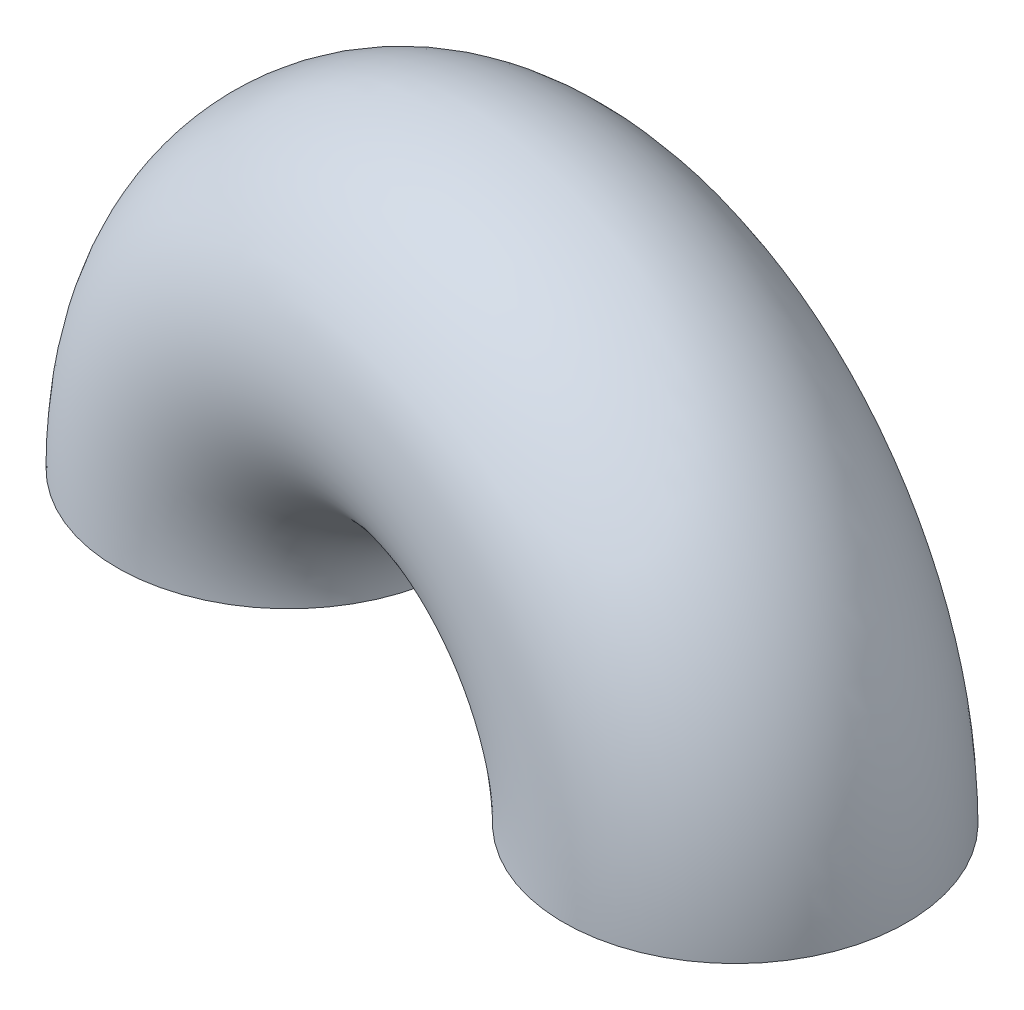
ISO-10303-21;
HEADER;
FILE_DESCRIPTION(('STEP AP214'),'2;1');
FILE_NAME('part.step','',(''),(''),'','','');
FILE_SCHEMA(('AUTOMOTIVE_DESIGN { 1 0 10303 214 1 1 1 1 }'));
ENDSEC;
DATA;
#1=APPLICATION_CONTEXT('core data for automotive mechanical design processes');
#2=APPLICATION_PROTOCOL_DEFINITION('international standard','automotive_design',2000,#1);
#3=PRODUCT_CONTEXT('',#1,'mechanical');
#4=PRODUCT('Part','Part','',(#3));
#5=PRODUCT_RELATED_PRODUCT_CATEGORY('part','',(#4));
#6=PRODUCT_DEFINITION_FORMATION('','',#4);
#7=PRODUCT_DEFINITION_CONTEXT('part definition',#1,'design');
#8=PRODUCT_DEFINITION('design','',#6,#7);
#9=PRODUCT_DEFINITION_SHAPE('','',#8);
#10=(LENGTH_UNIT() NAMED_UNIT(*) SI_UNIT(.MILLI.,.METRE.));
#11=(NAMED_UNIT(*) PLANE_ANGLE_UNIT() SI_UNIT($,.RADIAN.));
#12=(NAMED_UNIT(*) SI_UNIT($,.STERADIAN.) SOLID_ANGLE_UNIT());
#13=UNCERTAINTY_MEASURE_WITH_UNIT(LENGTH_MEASURE(1.E-05),#10,'distance_accuracy_value','');
#14=(GEOMETRIC_REPRESENTATION_CONTEXT(3) GLOBAL_UNCERTAINTY_ASSIGNED_CONTEXT((#13)) GLOBAL_UNIT_ASSIGNED_CONTEXT((#10,
#11,#12)) REPRESENTATION_CONTEXT('',''));
#15=CARTESIAN_POINT('',(0.,0.,0.));
#16=DIRECTION('',(0.,0.,1.));
#17=DIRECTION('',(1.,0.,0.));
#18=AXIS2_PLACEMENT_3D('',#15,#16,#17);
#19=CARTESIAN_POINT('',(0.,0.,-37.5));
#20=DIRECTION('',(0.,1.,0.));
#21=DIRECTION('',(0.,0.,1.));
#22=AXIS2_PLACEMENT_3D('',#19,#20,#21);
#23=PLANE('',#22);
#24=CARTESIAN_POINT('',(0.,0.,-37.5));
#25=DIRECTION('',(0.,1.,0.));
#26=DIRECTION('',(0.,0.,1.));
#27=AXIS2_PLACEMENT_3D('',#24,#25,#26);
#28=CIRCLE('',#27,3.75);
#29=CARTESIAN_POINT('',(-3.70383127723177,0.,-38.0866292439009));
#30=VERTEX_POINT('',#29);
#31=EDGE_CURVE('E47',#30,#30,#28,.T.);
#32=ORIENTED_EDGE('',*,*,#31,.F.);
#33=EDGE_LOOP('',(#32));
#34=FACE_BOUND('',#33,.T.);
#35=ADVANCED_FACE('F41',(#34),#23,.F.);
#36=CARTESIAN_POINT('',(11.5881372890606,0.,-35.6646193610683));
#37=DIRECTION('',(0.,-1.,0.));
#38=DIRECTION('',(-0.309016994374948,0.,0.951056516295153));
#39=AXIS2_PLACEMENT_3D('',#36,#37,#38);
#40=PLANE('',#39);
#41=CARTESIAN_POINT('',(11.5881372890606,0.,-35.6646193610683));
#42=DIRECTION('',(0.,-1.,0.));
#43=DIRECTION('',(-0.309016994374948,0.,0.951056516295153));
#44=AXIS2_PLACEMENT_3D('',#41,#42,#43);
#45=CIRCLE('',#44,3.75);
#46=CARTESIAN_POINT('',(15.2919685662923,0.,-35.0779901171674));
#47=VERTEX_POINT('',#46);
#48=EDGE_CURVE('E11',#47,#47,#45,.T.);
#49=ORIENTED_EDGE('',*,*,#48,.T.);
#50=EDGE_LOOP('',(#49));
#51=FACE_BOUND('',#50,.T.);
#52=ADVANCED_FACE('F56',(#51),#40,.T.);
#53=CARTESIAN_POINT('',(5.79406864453028,0.,-36.5823096805341));
#54=DIRECTION('',(0.156434465040231,0.,-0.987688340595138));
#55=DIRECTION('',(-0.987688340595138,0.,-0.156434465040231));
#56=AXIS2_PLACEMENT_3D('',#53,#54,#55);
#57=TOROIDAL_SURFACE('',#56,5.86629243900868,3.75);
#58=CARTESIAN_POINT('',(5.79406864453028,0.,-36.5823096805341));
#59=DIRECTION('',(0.156434465040231,0.,-0.987688340595138));
#60=DIRECTION('',(-0.987688340595138,0.,-0.156434465040231));
#61=AXIS2_PLACEMENT_3D('',#58,#59,#60);
#62=CIRCLE('',#61,9.61629243900867);
#63=EDGE_CURVE('',#30,#47,#62,.T.);
#64=ORIENTED_EDGE('',*,*,#31,.T.);
#65=ORIENTED_EDGE('',*,*,#48,.F.);
#66=ORIENTED_EDGE('',*,*,#63,.T.);
#67=ORIENTED_EDGE('',*,*,#63,.F.);
#68=EDGE_LOOP('',(#64,#66,#65,#67));
#69=FACE_BOUND('',#68,.T.);
#70=ADVANCED_FACE('F53',(#69),#57,.T.);
#71=CLOSED_SHELL('',(#35,#52,#70));
#72=MANIFOLD_SOLID_BREP('B2',#71);
#73=ADVANCED_BREP_SHAPE_REPRESENTATION('',(#18,#72),#14);
#74=SHAPE_DEFINITION_REPRESENTATION(#9,#73);
ENDSEC;
END-ISO-10303-21;
